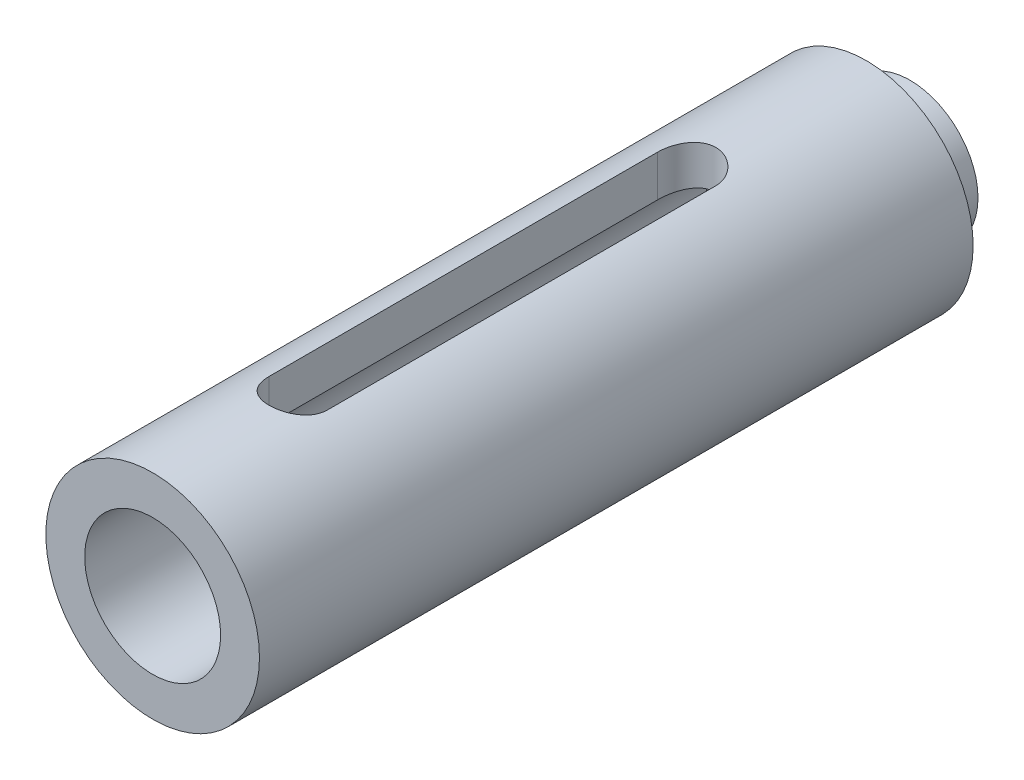
ISO-10303-21;
HEADER;
FILE_DESCRIPTION(('STEP AP214'),'2;1');
FILE_NAME('part.step','',(''),(''),'','','');
FILE_SCHEMA(('AUTOMOTIVE_DESIGN { 1 0 10303 214 1 1 1 1 }'));
ENDSEC;
DATA;
#1=APPLICATION_CONTEXT('core data for automotive mechanical design processes');
#2=APPLICATION_PROTOCOL_DEFINITION('international standard','automotive_design',2000,#1);
#3=PRODUCT_CONTEXT('',#1,'mechanical');
#4=PRODUCT('Part','Part','',(#3));
#5=PRODUCT_RELATED_PRODUCT_CATEGORY('part','',(#4));
#6=PRODUCT_DEFINITION_FORMATION('','',#4);
#7=PRODUCT_DEFINITION_CONTEXT('part definition',#1,'design');
#8=PRODUCT_DEFINITION('design','',#6,#7);
#9=PRODUCT_DEFINITION_SHAPE('','',#8);
#10=(LENGTH_UNIT() NAMED_UNIT(*) SI_UNIT(.MILLI.,.METRE.));
#11=(NAMED_UNIT(*) PLANE_ANGLE_UNIT() SI_UNIT($,.RADIAN.));
#12=(NAMED_UNIT(*) SI_UNIT($,.STERADIAN.) SOLID_ANGLE_UNIT());
#13=UNCERTAINTY_MEASURE_WITH_UNIT(LENGTH_MEASURE(1.E-05),#10,'distance_accuracy_value','');
#14=(GEOMETRIC_REPRESENTATION_CONTEXT(3) GLOBAL_UNCERTAINTY_ASSIGNED_CONTEXT((#13)) GLOBAL_UNIT_ASSIGNED_CONTEXT((#10,
#11,#12)) REPRESENTATION_CONTEXT('',''));
#15=CARTESIAN_POINT('',(0.,0.,0.));
#16=DIRECTION('',(0.,0.,1.));
#17=DIRECTION('',(1.,0.,0.));
#18=AXIS2_PLACEMENT_3D('',#15,#16,#17);
#19=CARTESIAN_POINT('',(0.,0.,39.));
#20=DIRECTION('',(0.,0.,-1.));
#21=DIRECTION('',(-1.,0.,0.));
#22=AXIS2_PLACEMENT_3D('',#19,#20,#21);
#23=CYLINDRICAL_SURFACE('',#22,5.5);
#24=CARTESIAN_POINT('',(0.,0.,39.));
#25=DIRECTION('',(0.,0.,1.));
#26=DIRECTION('',(1.,0.,0.));
#27=AXIS2_PLACEMENT_3D('',#24,#25,#26);
#28=CIRCLE('',#27,5.5);
#29=CARTESIAN_POINT('',(5.5,0.,39.));
#30=VERTEX_POINT('',#29);
#31=EDGE_CURVE('E190',#30,#30,#28,.T.);
#32=ORIENTED_EDGE('',*,*,#31,.F.);
#33=EDGE_LOOP('',(#32));
#34=FACE_BOUND('',#33,.T.);
#35=CARTESIAN_POINT('',(0.,0.,2.25));
#36=DIRECTION('',(0.,0.,1.));
#37=DIRECTION('',(1.,0.,0.));
#38=AXIS2_PLACEMENT_3D('',#35,#36,#37);
#39=CIRCLE('',#38,5.5);
#40=CARTESIAN_POINT('',(5.5,0.,2.25));
#41=VERTEX_POINT('',#40);
#42=EDGE_CURVE('E193',#41,#41,#39,.T.);
#43=ORIENTED_EDGE('',*,*,#42,.T.);
#44=EDGE_LOOP('',(#43));
#45=FACE_BOUND('',#44,.T.);
#46=CARTESIAN_POINT('',(-1.5,5.29150262212918,31.5));
#47=CARTESIAN_POINT('',(-1.50000065614258,5.29149951287645,31.5413586771312));
#48=CARTESIAN_POINT('',(-1.49828836695378,5.29198813067695,31.5826967174448));
#49=CARTESIAN_POINT('',(-1.4914634878254,5.29391683071276,31.665060919094));
#50=CARTESIAN_POINT('',(-1.48635155213404,5.29535672987746,31.7060871389019));
#51=CARTESIAN_POINT('',(-1.4659957743833,5.30104390546256,31.8280638279342));
#52=CARTESIAN_POINT('',(-1.44573158809946,5.3066590533821,31.9081717517128));
#53=CARTESIAN_POINT('',(-1.39248960546167,5.32087596000829,32.0636823792342));
#54=CARTESIAN_POINT('',(-1.35951439878664,5.32947711032649,32.1390860377668));
#55=CARTESIAN_POINT('',(-1.28183272379104,5.34869152359558,32.2833363247575));
#56=CARTESIAN_POINT('',(-1.23712210444531,5.35930549814899,32.3521806212842));
#57=CARTESIAN_POINT('',(-1.13600122474008,5.38165753008407,32.4831093842187));
#58=CARTESIAN_POINT('',(-1.07934088585637,5.39341613066433,32.5449971540217));
#59=CARTESIAN_POINT('',(-0.956461732608837,5.41655647328188,32.6585245043545));
#60=CARTESIAN_POINT('',(-0.890241359657288,5.42793815349654,32.710162410566));
#61=CARTESIAN_POINT('',(-0.74874592637817,5.44927296987059,32.8025497869689));
#62=CARTESIAN_POINT('',(-0.673337368132524,5.45919887577009,32.8431016292155));
#63=CARTESIAN_POINT('',(-0.516459920283584,5.47626555970112,32.9108741176048));
#64=CARTESIAN_POINT('',(-0.434992386948293,5.48340695880811,32.9380977369125));
#65=CARTESIAN_POINT('',(-0.270372333378635,5.4939545039919,32.9778008905397));
#66=CARTESIAN_POINT('',(-0.187306582582991,5.49744582097804,32.9906171693652));
#67=CARTESIAN_POINT('',(-0.0201336919041043,5.50059802936423,33.0022023262439));
#68=CARTESIAN_POINT('',(0.0639732864586811,5.5002595076115,33.0009733564539));
#69=CARTESIAN_POINT('',(0.228490462517258,5.49585205334204,32.9847375636845));
#70=CARTESIAN_POINT('',(0.308939654543513,5.49188174604376,32.9700949870401));
#71=CARTESIAN_POINT('',(0.466191763842098,5.48077387077341,32.9280373916438));
#72=CARTESIAN_POINT('',(0.542994504246747,5.4736361493423,32.9006217540427));
#73=CARTESIAN_POINT('',(0.691693940248361,5.45685080885045,32.8335225667126));
#74=CARTESIAN_POINT('',(0.763532127876887,5.4471781578563,32.7937158769118));
#75=CARTESIAN_POINT('',(0.899630490987049,5.42636266875342,32.7030600650156));
#76=CARTESIAN_POINT('',(0.963889270458089,5.41521956060735,32.6522089135854));
#77=CARTESIAN_POINT('',(1.08517422056187,5.39224743714906,32.5389883824669));
#78=CARTESIAN_POINT('',(1.14190346514491,5.38040788259406,32.4763027230678));
#79=CARTESIAN_POINT('',(1.24413117092707,5.35769431111201,32.3421688095626));
#80=CARTESIAN_POINT('',(1.28962650490379,5.34682056357816,32.2707181237724));
#81=CARTESIAN_POINT('',(1.36833955307723,5.32722349729034,32.1204025936236));
#82=CARTESIAN_POINT('',(1.40146611945396,5.3185162949769,32.0414878786216));
#83=CARTESIAN_POINT('',(1.45384162162887,5.3044408104789,31.8789564527364));
#84=CARTESIAN_POINT('',(1.47311145681179,5.29906750164299,31.7953470288624));
#85=CARTESIAN_POINT('',(1.49007935332103,5.29430661617749,31.6758227800667));
#86=CARTESIAN_POINT('',(1.49379981070631,5.29325702758222,31.6407417701382));
#87=CARTESIAN_POINT('',(1.49875756431611,5.29185517593002,31.5704462233799));
#88=CARTESIAN_POINT('',(1.49999874802878,5.29150182119389,31.5352319824707));
#89=CARTESIAN_POINT('',(1.5,5.29150262212918,31.5));
#90=B_SPLINE_CURVE_WITH_KNOTS('',3,(#46,#47,#48,#49,#50,#51,#52,#53,#54,#55,#56,#57,#58,#59,#60,
#61,#62,#63,#64,#65,#66,#67,#68,#69,#70,#71,#72,#73,#74,#75,#76,#77,#78,#79,#80,#81,#82,#83,#84,
#85,#86,#87,#88,#89),.UNSPECIFIED.,.F.,.F.,(4,2,2,2,2,2,2,2,2,2,2,2,2,2,2,2,2,2,2,2,2,4),(0.,
0.12399719781435,0.247970539772065,0.495149163222105,0.742277454344912,0.989493277237657,
1.24251425254214,1.49557652494464,1.75289280816834,2.01015166492879,2.26126373288136,
2.51233732338575,2.75678883822397,3.00125219786344,3.24822703625944,3.49524729282972,
3.75016526342509,4.00515411661573,4.26198658762753,4.51843087447629,4.62423405012692,
4.72987119631509),.UNSPECIFIED.);
#91=CARTESIAN_POINT('',(-1.5,5.29150262212918,31.5));
#92=VERTEX_POINT('',#91);
#93=CARTESIAN_POINT('',(1.5,5.29150262212918,31.5));
#94=VERTEX_POINT('',#93);
#95=EDGE_CURVE('E75',#92,#94,#90,.T.);
#96=ORIENTED_EDGE('',*,*,#95,.F.);
#97=DIRECTION('',(0.,0.,-1.));
#98=VECTOR('',#97,1.);
#99=CARTESIAN_POINT('',(-1.5,5.29150262212918,39.));
#100=LINE('',#99,#98);
#101=CARTESIAN_POINT('',(-1.5,5.29150262212918,11.5));
#102=VERTEX_POINT('',#101);
#103=EDGE_CURVE('E116',#102,#92,#100,.F.);
#104=ORIENTED_EDGE('',*,*,#103,.F.);
#105=CARTESIAN_POINT('',(1.5,5.29150262212918,11.5));
#106=CARTESIAN_POINT('',(1.50000065614258,5.29149951287646,11.4586413228689));
#107=CARTESIAN_POINT('',(1.49828836695378,5.29198813067696,11.4173032825552));
#108=CARTESIAN_POINT('',(1.4914634878254,5.29391683071276,11.334939080906));
#109=CARTESIAN_POINT('',(1.48635155213404,5.29535672987746,11.2939128610981));
#110=CARTESIAN_POINT('',(1.4659957743833,5.30104390546256,11.1719361720658));
#111=CARTESIAN_POINT('',(1.44573158809946,5.3066590533821,11.0918282482872));
#112=CARTESIAN_POINT('',(1.39248960546167,5.32087596000829,10.9363176207658));
#113=CARTESIAN_POINT('',(1.35951439878664,5.32947711032649,10.8609139622332));
#114=CARTESIAN_POINT('',(1.28183272379104,5.34869152359558,10.7166636752425));
#115=CARTESIAN_POINT('',(1.23712210444531,5.35930549814899,10.6478193787158));
#116=CARTESIAN_POINT('',(1.13600122474008,5.38165753008407,10.5168906157813));
#117=CARTESIAN_POINT('',(1.07934088585636,5.39341613066433,10.4550028459783));
#118=CARTESIAN_POINT('',(0.956461732608836,5.41655647328188,10.3414754956455));
#119=CARTESIAN_POINT('',(0.890241359657286,5.42793815349654,10.289837589434));
#120=CARTESIAN_POINT('',(0.748745926378168,5.44927296987059,10.1974502130311));
#121=CARTESIAN_POINT('',(0.673337368132523,5.45919887577009,10.1568983707845));
#122=CARTESIAN_POINT('',(0.516459920283583,5.47626555970112,10.0891258823952));
#123=CARTESIAN_POINT('',(0.434992386948292,5.48340695880811,10.0619022630875));
#124=CARTESIAN_POINT('',(0.270372333378634,5.4939545039919,10.0221991094603));
#125=CARTESIAN_POINT('',(0.187306582582992,5.49744582097804,10.0093828306348));
#126=CARTESIAN_POINT('',(0.0201336919041063,5.50059802936423,9.99779767375611));
#127=CARTESIAN_POINT('',(-0.0639732864586786,5.50025950761149,9.99902664354613));
#128=CARTESIAN_POINT('',(-0.228490462517255,5.49585205334204,10.0152624363155));
#129=CARTESIAN_POINT('',(-0.30893965454351,5.49188174604376,10.0299050129599));
#130=CARTESIAN_POINT('',(-0.466191763842096,5.48077387077341,10.0719626083562));
#131=CARTESIAN_POINT('',(-0.542994504246745,5.47363614934231,10.0993782459573));
#132=CARTESIAN_POINT('',(-0.691693940248361,5.45685080885045,10.1664774332874));
#133=CARTESIAN_POINT('',(-0.763532127876888,5.4471781578563,10.2062841230882));
#134=CARTESIAN_POINT('',(-0.899630490987049,5.42636266875342,10.2969399349844));
#135=CARTESIAN_POINT('',(-0.963889270458088,5.41521956060735,10.3477910864146));
#136=CARTESIAN_POINT('',(-1.08517422056187,5.39224743714906,10.4610116175331));
#137=CARTESIAN_POINT('',(-1.14190346514491,5.38040788259406,10.5236972769322));
#138=CARTESIAN_POINT('',(-1.24413117092707,5.35769431111201,10.6578311904374));
#139=CARTESIAN_POINT('',(-1.28962650490378,5.34682056357816,10.7292818762276));
#140=CARTESIAN_POINT('',(-1.36833955307723,5.32722349729034,10.8795974063764));
#141=CARTESIAN_POINT('',(-1.40146611945396,5.3185162949769,10.9585121213784));
#142=CARTESIAN_POINT('',(-1.45384162162886,5.3044408104789,11.1210435472636));
#143=CARTESIAN_POINT('',(-1.47311145681179,5.29906750164299,11.2046529711376));
#144=CARTESIAN_POINT('',(-1.49007935332103,5.29430661617749,11.3241772199333));
#145=CARTESIAN_POINT('',(-1.4937998107063,5.29325702758222,11.3592582298618));
#146=CARTESIAN_POINT('',(-1.49875756431611,5.29185517593002,11.4295537766201));
#147=CARTESIAN_POINT('',(-1.49999874802878,5.29150182119389,11.4647680175292));
#148=CARTESIAN_POINT('',(-1.5,5.29150262212918,11.5));
#149=B_SPLINE_CURVE_WITH_KNOTS('',3,(#105,#106,#107,#108,#109,#110,#111,#112,#113,#114,#115,
#116,#117,#118,#119,#120,#121,#122,#123,#124,#125,#126,#127,#128,#129,#130,#131,#132,#133,#134,
#135,#136,#137,#138,#139,#140,#141,#142,#143,#144,#145,#146,#147,#148),.UNSPECIFIED.,.F.,.F.,(4,
2,2,2,2,2,2,2,2,2,2,2,2,2,2,2,2,2,2,2,2,4),(0.,0.123997197814348,0.24797053977206,
0.495149163222103,0.742277454344915,0.989493277237657,1.24251425254214,1.49557652494464,
1.75289280816834,2.01015166492879,2.26126373288136,2.51233732338574,2.75678883822397,
3.00125219786344,3.24822703625944,3.49524729282972,3.75016526342509,4.00515411661572,
4.26198658762753,4.51843087447629,4.62423405012691,4.72987119631509),.UNSPECIFIED.);
#150=CARTESIAN_POINT('',(1.5,5.29150262212918,11.5));
#151=VERTEX_POINT('',#150);
#152=EDGE_CURVE('E110',#151,#102,#149,.T.);
#153=ORIENTED_EDGE('',*,*,#152,.F.);
#154=DIRECTION('',(0.,0.,-1.));
#155=VECTOR('',#154,1.);
#156=CARTESIAN_POINT('',(1.5,5.29150262212918,39.));
#157=LINE('',#156,#155);
#158=EDGE_CURVE('E100',#94,#151,#157,.T.);
#159=ORIENTED_EDGE('',*,*,#158,.F.);
#160=EDGE_LOOP('',(#96,#104,#153,#159));
#161=FACE_BOUND('',#160,.T.);
#162=ADVANCED_FACE('F53',(#34,#45,#161),#23,.T.);
#163=CARTESIAN_POINT('',(0.,0.,6.));
#164=DIRECTION('',(0.,0.,1.));
#165=DIRECTION('',(1.,0.,0.));
#166=AXIS2_PLACEMENT_3D('',#163,#164,#165);
#167=CYLINDRICAL_SURFACE('',#166,3.5);
#168=CARTESIAN_POINT('',(0.,0.,39.));
#169=DIRECTION('',(0.,0.,1.));
#170=DIRECTION('',(1.,0.,0.));
#171=AXIS2_PLACEMENT_3D('',#168,#169,#170);
#172=CIRCLE('',#171,3.5);
#173=CARTESIAN_POINT('',(3.5,0.,39.));
#174=VERTEX_POINT('',#173);
#175=EDGE_CURVE('E195',#174,#174,#172,.T.);
#176=ORIENTED_EDGE('',*,*,#175,.T.);
#177=EDGE_LOOP('',(#176));
#178=FACE_BOUND('',#177,.T.);
#179=CARTESIAN_POINT('',(0.,0.,7.));
#180=DIRECTION('',(0.,0.,1.));
#181=DIRECTION('',(1.,0.,0.));
#182=AXIS2_PLACEMENT_3D('',#179,#180,#181);
#183=CIRCLE('',#182,3.5);
#184=CARTESIAN_POINT('',(3.5,0.,7.));
#185=VERTEX_POINT('',#184);
#186=EDGE_CURVE('E205',#185,#185,#183,.F.);
#187=ORIENTED_EDGE('',*,*,#186,.T.);
#188=EDGE_LOOP('',(#187));
#189=FACE_BOUND('',#188,.T.);
#190=CARTESIAN_POINT('',(-1.5,3.16227766016838,11.5));
#191=CARTESIAN_POINT('',(-1.50000205158182,3.16227172915896,11.4599135146663));
#192=CARTESIAN_POINT('',(-1.49839203232259,3.1630408475052,11.4198485718744));
#193=CARTESIAN_POINT('',(-1.49198428946633,3.16607042202108,11.3400484203015));
#194=CARTESIAN_POINT('',(-1.48718796282877,3.16833022463316,11.3003130747429));
#195=CARTESIAN_POINT('',(-1.46813912125427,3.17722728946027,11.1823937689412));
#196=CARTESIAN_POINT('',(-1.44922583932205,3.18598345536625,11.1050687808182));
#197=CARTESIAN_POINT('',(-1.39976461136192,3.20801790875919,10.9551156075282));
#198=CARTESIAN_POINT('',(-1.36923164559686,3.22129037144911,10.8824815152318));
#199=CARTESIAN_POINT('',(-1.2974990785691,3.25084584760997,10.7432742371671));
#200=CARTESIAN_POINT('',(-1.25628763381382,3.26713219801237,10.6767078926545));
#201=CARTESIAN_POINT('',(-1.1615127619978,3.30205717606893,10.5472677131178));
#202=CARTESIAN_POINT('',(-1.10736251117419,3.32077798174483,10.4848457931263));
#203=CARTESIAN_POINT('',(-0.989484514819077,3.35778717574372,10.3696396879861));
#204=CARTESIAN_POINT('',(-0.925754657803534,3.37607546770334,10.316857633299));
#205=CARTESIAN_POINT('',(-0.786887325105809,3.41118224346912,10.220040304264));
#206=CARTESIAN_POINT('',(-0.711357460352783,3.42789299069227,10.1765252226538));
#207=CARTESIAN_POINT('',(-0.553203285157879,3.45693715519552,10.1030178065824));
#208=CARTESIAN_POINT('',(-0.470582344296452,3.46927263739378,10.0730190912237));
#209=CARTESIAN_POINT('',(-0.305382852613865,3.48758727558559,10.0290676740215));
#210=CARTESIAN_POINT('',(-0.223049040583706,3.49387712926986,10.0143272294632));
#211=CARTESIAN_POINT('',(-0.0568512092475041,3.50052462207484,9.99875866798853));
#212=CARTESIAN_POINT('',(0.0270121642089485,3.5008847094983,9.99792480927038));
#213=CARTESIAN_POINT('',(0.188134909775348,3.49581014412271,10.0097951744332));
#214=CARTESIAN_POINT('',(0.265472112983466,3.49074670592789,10.0216321098349));
#215=CARTESIAN_POINT('',(0.416937196296515,3.4759108524252,10.0570124624822));
#216=CARTESIAN_POINT('',(0.491064896646151,3.46613817373677,10.0805565344921));
#217=CARTESIAN_POINT('',(0.635378523321033,3.44263354171508,10.138953093173));
#218=CARTESIAN_POINT('',(0.705486754278657,3.42884327932154,10.173973144561));
#219=CARTESIAN_POINT('',(0.83901686910716,3.39863858179159,10.2541581649458));
#220=CARTESIAN_POINT('',(0.902436253822039,3.38222317154386,10.2993269062087));
#221=CARTESIAN_POINT('',(1.02577016313475,3.34697002113492,10.402401400172));
#222=CARTESIAN_POINT('',(1.08507946000173,3.32804291875889,10.4610016817817));
#223=CARTESIAN_POINT('',(1.19330742755405,3.29079030157284,10.5873443548011));
#224=CARTESIAN_POINT('',(1.24222039124859,3.27246512182606,10.6550917342493));
#225=CARTESIAN_POINT('',(1.32996504850602,3.23782407189493,10.8009291201985));
#226=CARTESIAN_POINT('',(1.36835678335718,3.22160763084711,10.8793090537974));
#227=CARTESIAN_POINT('',(1.43110327719245,3.19423395895919,11.0422552843354));
#228=CARTESIAN_POINT('',(1.45548472338104,3.18306711820121,11.1268094716141));
#229=CARTESIAN_POINT('',(1.4814873301113,3.17100823245485,11.2601895278314));
#230=CARTESIAN_POINT('',(1.48841599831505,3.16775315136151,11.3078246910931));
#231=CARTESIAN_POINT('',(1.49767523433545,3.16338096148832,11.4036286930541));
#232=CARTESIAN_POINT('',(1.50000646350526,3.1622635452007,11.4517974539914));
#233=CARTESIAN_POINT('',(1.5,3.16227766016838,11.5));
#234=B_SPLINE_CURVE_WITH_KNOTS('',3,(#190,#191,#192,#193,#194,#195,#196,#197,#198,#199,#200,
#201,#202,#203,#204,#205,#206,#207,#208,#209,#210,#211,#212,#213,#214,#215,#216,#217,#218,#219,
#220,#221,#222,#223,#224,#225,#226,#227,#228,#229,#230,#231,#232,#233),.UNSPECIFIED.,.F.,.F.,(4,
2,2,2,2,2,2,2,2,2,2,2,2,2,2,2,2,2,2,2,2,4),(0.,0.120178259529695,0.240303864547873,
0.479289547584349,0.717968164917669,0.956912642123788,1.21000319798865,1.46314962070247,
1.72805510455523,1.99283539866898,2.24313667812652,2.49333460971909,2.7274403928306,
2.96155927063751,3.19926143660833,3.43705210302752,3.69241313593937,3.94791398743396,
4.21286818151524,4.47731599572957,4.62181159425245,4.76628640520367),.UNSPECIFIED.);
#235=CARTESIAN_POINT('',(-1.5,3.16227766016838,11.5));
#236=VERTEX_POINT('',#235);
#237=CARTESIAN_POINT('',(1.5,3.16227766016838,11.5));
#238=VERTEX_POINT('',#237);
#239=EDGE_CURVE('E11',#236,#238,#234,.T.);
#240=ORIENTED_EDGE('',*,*,#239,.F.);
#241=DIRECTION('',(0.,0.,1.));
#242=VECTOR('',#241,1.);
#243=CARTESIAN_POINT('',(-1.5,3.16227766016838,6.));
#244=LINE('',#243,#242);
#245=CARTESIAN_POINT('',(-1.5,3.16227766016838,31.5));
#246=VERTEX_POINT('',#245);
#247=EDGE_CURVE('E68',#246,#236,#244,.F.);
#248=ORIENTED_EDGE('',*,*,#247,.F.);
#249=CARTESIAN_POINT('',(1.5,3.16227766016838,31.5));
#250=CARTESIAN_POINT('',(1.50000205158182,3.16227172915896,31.5400864853337));
#251=CARTESIAN_POINT('',(1.49839203232259,3.1630408475052,31.5801514281256));
#252=CARTESIAN_POINT('',(1.49198428946633,3.16607042202108,31.6599515796985));
#253=CARTESIAN_POINT('',(1.48718796282877,3.16833022463316,31.6996869252571));
#254=CARTESIAN_POINT('',(1.46813912125427,3.17722728946027,31.8176062310588));
#255=CARTESIAN_POINT('',(1.44922583932205,3.18598345536625,31.8949312191818));
#256=CARTESIAN_POINT('',(1.39976461136192,3.20801790875919,32.0448843924718));
#257=CARTESIAN_POINT('',(1.36923164559687,3.22129037144911,32.1175184847682));
#258=CARTESIAN_POINT('',(1.2974990785691,3.25084584760997,32.2567257628329));
#259=CARTESIAN_POINT('',(1.25628763381383,3.26713219801237,32.3232921073455));
#260=CARTESIAN_POINT('',(1.1615127619978,3.30205717606893,32.4527322868822));
#261=CARTESIAN_POINT('',(1.10736251117419,3.32077798174483,32.5151542068737));
#262=CARTESIAN_POINT('',(0.989484514819079,3.35778717574372,32.6303603120139));
#263=CARTESIAN_POINT('',(0.925754657803536,3.37607546770334,32.683142366701));
#264=CARTESIAN_POINT('',(0.786887325105812,3.41118224346912,32.779959695736));
#265=CARTESIAN_POINT('',(0.711357460352786,3.42789299069227,32.8234747773462));
#266=CARTESIAN_POINT('',(0.55320328515788,3.45693715519552,32.8969821934176));
#267=CARTESIAN_POINT('',(0.470582344296453,3.46927263739377,32.9269809087763));
#268=CARTESIAN_POINT('',(0.305382852613867,3.48758727558559,32.9709323259785));
#269=CARTESIAN_POINT('',(0.223049040583709,3.49387712926986,32.9856727705369));
#270=CARTESIAN_POINT('',(0.0568512092475087,3.50052462207484,33.0012413320115));
#271=CARTESIAN_POINT('',(-0.0270121642089433,3.5008847094983,33.0020751907296));
#272=CARTESIAN_POINT('',(-0.188134909775342,3.49581014412271,32.9902048255668));
#273=CARTESIAN_POINT('',(-0.265472112983461,3.49074670592789,32.9783678901651));
#274=CARTESIAN_POINT('',(-0.416937196296511,3.4759108524252,32.9429875375179));
#275=CARTESIAN_POINT('',(-0.491064896646147,3.46613817373677,32.9194434655079));
#276=CARTESIAN_POINT('',(-0.635378523321029,3.44263354171508,32.861046906827));
#277=CARTESIAN_POINT('',(-0.705486754278652,3.42884327932154,32.826026855439));
#278=CARTESIAN_POINT('',(-0.839016869107154,3.39863858179159,32.7458418350542));
#279=CARTESIAN_POINT('',(-0.902436253822034,3.38222317154386,32.7006730937913));
#280=CARTESIAN_POINT('',(-1.02577016313474,3.34697002113492,32.597598599828));
#281=CARTESIAN_POINT('',(-1.08507946000172,3.32804291875889,32.5389983182183));
#282=CARTESIAN_POINT('',(-1.19330742755404,3.29079030157285,32.4126556451989));
#283=CARTESIAN_POINT('',(-1.24222039124859,3.27246512182606,32.3449082657507));
#284=CARTESIAN_POINT('',(-1.32996504850602,3.23782407189493,32.1990708798015));
#285=CARTESIAN_POINT('',(-1.36835678335717,3.22160763084711,32.1206909462026));
#286=CARTESIAN_POINT('',(-1.43110327719244,3.19423395895919,31.9577447156646));
#287=CARTESIAN_POINT('',(-1.45548472338104,3.18306711820121,31.873190528386));
#288=CARTESIAN_POINT('',(-1.4814873301113,3.17100823245484,31.7398104721686));
#289=CARTESIAN_POINT('',(-1.48841599831505,3.16775315136151,31.6921753089069));
#290=CARTESIAN_POINT('',(-1.49767523433545,3.16338096148832,31.5963713069459));
#291=CARTESIAN_POINT('',(-1.50000646350526,3.1622635452007,31.5482025460086));
#292=CARTESIAN_POINT('',(-1.5,3.16227766016838,31.5));
#293=B_SPLINE_CURVE_WITH_KNOTS('',3,(#249,#250,#251,#252,#253,#254,#255,#256,#257,#258,#259,
#260,#261,#262,#263,#264,#265,#266,#267,#268,#269,#270,#271,#272,#273,#274,#275,#276,#277,#278,
#279,#280,#281,#282,#283,#284,#285,#286,#287,#288,#289,#290,#291,#292),.UNSPECIFIED.,.F.,.F.,(4,
2,2,2,2,2,2,2,2,2,2,2,2,2,2,2,2,2,2,2,2,4),(0.,0.120178259529692,0.240303864547869,
0.479289547584345,0.717968164917653,0.956912642123792,1.21000319798865,1.46314962070247,
1.72805510455524,1.99283539866898,2.24313667812652,2.49333460971908,2.7274403928306,
2.96155927063751,3.19926143660833,3.43705210302752,3.69241313593936,3.94791398743395,
4.21286818151524,4.47731599572956,4.62181159425245,4.76628640520368),.UNSPECIFIED.);
#294=CARTESIAN_POINT('',(1.5,3.16227766016838,31.5));
#295=VERTEX_POINT('',#294);
#296=EDGE_CURVE('E153',#295,#246,#293,.T.);
#297=ORIENTED_EDGE('',*,*,#296,.F.);
#298=DIRECTION('',(0.,0.,1.));
#299=VECTOR('',#298,1.);
#300=CARTESIAN_POINT('',(1.5,3.16227766016838,6.));
#301=LINE('',#300,#299);
#302=EDGE_CURVE('E159',#238,#295,#301,.T.);
#303=ORIENTED_EDGE('',*,*,#302,.F.);
#304=EDGE_LOOP('',(#240,#248,#297,#303));
#305=FACE_BOUND('',#304,.T.);
#306=ADVANCED_FACE('F144',(#178,#189,#305),#167,.F.);
#307=CARTESIAN_POINT('',(0.,0.,2.25));
#308=DIRECTION('',(0.,0.,-1.));
#309=DIRECTION('',(-1.,0.,0.));
#310=AXIS2_PLACEMENT_3D('',#307,#308,#309);
#311=CYLINDRICAL_SURFACE('',#310,3.5);
#312=CARTESIAN_POINT('',(0.,0.,2.25));
#313=DIRECTION('',(0.,0.,1.));
#314=DIRECTION('',(1.,0.,0.));
#315=AXIS2_PLACEMENT_3D('',#312,#313,#314);
#316=CIRCLE('',#315,3.5);
#317=CARTESIAN_POINT('',(3.5,0.,2.25));
#318=VERTEX_POINT('',#317);
#319=EDGE_CURVE('E202',#318,#318,#316,.T.);
#320=ORIENTED_EDGE('',*,*,#319,.F.);
#321=EDGE_LOOP('',(#320));
#322=FACE_BOUND('',#321,.T.);
#323=CARTESIAN_POINT('',(0.,0.,0.));
#324=DIRECTION('',(0.,0.,1.));
#325=DIRECTION('',(1.,0.,0.));
#326=AXIS2_PLACEMENT_3D('',#323,#324,#325);
#327=CIRCLE('',#326,3.5);
#328=CARTESIAN_POINT('',(3.5,0.,0.));
#329=VERTEX_POINT('',#328);
#330=EDGE_CURVE('E197',#329,#329,#327,.T.);
#331=ORIENTED_EDGE('',*,*,#330,.T.);
#332=EDGE_LOOP('',(#331));
#333=FACE_BOUND('',#332,.T.);
#334=ADVANCED_FACE('F148',(#322,#333),#311,.T.);
#335=CARTESIAN_POINT('',(0.,0.,0.));
#336=DIRECTION('',(0.,0.,1.));
#337=DIRECTION('',(1.,0.,0.));
#338=AXIS2_PLACEMENT_3D('',#335,#336,#337);
#339=PLANE('',#338);
#340=CARTESIAN_POINT('',(0.,0.,0.));
#341=DIRECTION('',(0.,0.,-1.));
#342=DIRECTION('',(-1.,0.,0.));
#343=AXIS2_PLACEMENT_3D('',#340,#341,#342);
#344=CIRCLE('',#343,2.);
#345=CARTESIAN_POINT('',(-2.,0.,0.));
#346=VERTEX_POINT('',#345);
#347=EDGE_CURVE('E120',#346,#346,#344,.T.);
#348=ORIENTED_EDGE('',*,*,#347,.F.);
#349=EDGE_LOOP('',(#348));
#350=FACE_BOUND('',#349,.T.);
#351=ORIENTED_EDGE('',*,*,#330,.F.);
#352=EDGE_LOOP('',(#351));
#353=FACE_BOUND('',#352,.T.);
#354=ADVANCED_FACE('F217',(#350,#353),#339,.F.);
#355=CARTESIAN_POINT('',(0.,0.,39.));
#356=DIRECTION('',(0.,0.,1.));
#357=DIRECTION('',(1.,0.,0.));
#358=AXIS2_PLACEMENT_3D('',#355,#356,#357);
#359=PLANE('',#358);
#360=ORIENTED_EDGE('',*,*,#175,.F.);
#361=EDGE_LOOP('',(#360));
#362=FACE_BOUND('',#361,.T.);
#363=ORIENTED_EDGE('',*,*,#31,.T.);
#364=EDGE_LOOP('',(#363));
#365=FACE_BOUND('',#364,.T.);
#366=ADVANCED_FACE('F150',(#362,#365),#359,.T.);
#367=CARTESIAN_POINT('',(0.,0.,2.25));
#368=DIRECTION('',(0.,0.,1.));
#369=DIRECTION('',(1.,0.,0.));
#370=AXIS2_PLACEMENT_3D('',#367,#368,#369);
#371=PLANE('',#370);
#372=ORIENTED_EDGE('',*,*,#319,.T.);
#373=EDGE_LOOP('',(#372));
#374=FACE_BOUND('',#373,.T.);
#375=ORIENTED_EDGE('',*,*,#42,.F.);
#376=EDGE_LOOP('',(#375));
#377=FACE_BOUND('',#376,.T.);
#378=ADVANCED_FACE('F142',(#374,#377),#371,.F.);
#379=CARTESIAN_POINT('',(0.,0.,39.001));
#380=DIRECTION('',(0.,0.,-1.));
#381=DIRECTION('',(-1.,0.,0.));
#382=AXIS2_PLACEMENT_3D('',#379,#380,#381);
#383=CYLINDRICAL_SURFACE('',#382,2.);
#384=CARTESIAN_POINT('',(0.,0.,6.));
#385=DIRECTION('',(0.,0.,1.));
#386=DIRECTION('',(1.,0.,0.));
#387=AXIS2_PLACEMENT_3D('',#384,#385,#386);
#388=CIRCLE('',#387,2.);
#389=CARTESIAN_POINT('',(2.,0.,6.));
#390=VERTEX_POINT('',#389);
#391=EDGE_CURVE('E117',#390,#390,#388,.F.);
#392=ORIENTED_EDGE('',*,*,#391,.F.);
#393=EDGE_LOOP('',(#392));
#394=FACE_BOUND('',#393,.T.);
#395=ORIENTED_EDGE('',*,*,#347,.T.);
#396=EDGE_LOOP('',(#395));
#397=FACE_BOUND('',#396,.T.);
#398=ADVANCED_FACE('F139',(#394,#397),#383,.F.);
#399=CARTESIAN_POINT('',(0.,0.,6.));
#400=DIRECTION('',(0.,0.,1.));
#401=DIRECTION('',(1.,0.,0.));
#402=AXIS2_PLACEMENT_3D('',#399,#400,#401);
#403=CONICAL_SURFACE('',#402,2.00000000000001,0.982793723247328);
#404=ORIENTED_EDGE('',*,*,#186,.F.);
#405=EDGE_LOOP('',(#404));
#406=FACE_BOUND('',#405,.T.);
#407=ORIENTED_EDGE('',*,*,#391,.T.);
#408=EDGE_LOOP('',(#407));
#409=FACE_BOUND('',#408,.T.);
#410=ADVANCED_FACE('F56',(#406,#409),#403,.F.);
#411=CARTESIAN_POINT('',(0.,5.5,11.5));
#412=DIRECTION('',(0.,-1.,0.));
#413=DIRECTION('',(0.,0.,-1.));
#414=AXIS2_PLACEMENT_3D('',#411,#412,#413);
#415=CYLINDRICAL_SURFACE('',#414,1.5);
#416=ORIENTED_EDGE('',*,*,#152,.T.);
#417=DIRECTION('',(0.,-1.,0.));
#418=VECTOR('',#417,1.);
#419=CARTESIAN_POINT('',(-1.5,5.5,11.5));
#420=LINE('',#419,#418);
#421=EDGE_CURVE('E105',#102,#236,#420,.T.);
#422=ORIENTED_EDGE('',*,*,#421,.T.);
#423=ORIENTED_EDGE('',*,*,#239,.T.);
#424=DIRECTION('',(0.,-1.,0.));
#425=VECTOR('',#424,1.);
#426=CARTESIAN_POINT('',(1.5,5.5,11.5));
#427=LINE('',#426,#425);
#428=EDGE_CURVE('E83',#151,#238,#427,.T.);
#429=ORIENTED_EDGE('',*,*,#428,.F.);
#430=EDGE_LOOP('',(#416,#422,#423,#429));
#431=FACE_BOUND('',#430,.T.);
#432=ADVANCED_FACE('F108',(#431),#415,.F.);
#433=CARTESIAN_POINT('',(-1.5,5.5,11.5));
#434=DIRECTION('',(1.,0.,0.));
#435=DIRECTION('',(0.,0.,-1.));
#436=AXIS2_PLACEMENT_3D('',#433,#434,#435);
#437=PLANE('',#436);
#438=ORIENTED_EDGE('',*,*,#103,.T.);
#439=DIRECTION('',(0.,-1.,0.));
#440=VECTOR('',#439,1.);
#441=CARTESIAN_POINT('',(-1.5,5.5,31.5));
#442=LINE('',#441,#440);
#443=EDGE_CURVE('E172',#92,#246,#442,.T.);
#444=ORIENTED_EDGE('',*,*,#443,.T.);
#445=ORIENTED_EDGE('',*,*,#247,.T.);
#446=ORIENTED_EDGE('',*,*,#421,.F.);
#447=EDGE_LOOP('',(#438,#444,#445,#446));
#448=FACE_BOUND('',#447,.T.);
#449=ADVANCED_FACE('F137',(#448),#437,.T.);
#450=CARTESIAN_POINT('',(0.,5.5,31.5));
#451=DIRECTION('',(0.,-1.,0.));
#452=DIRECTION('',(0.,0.,-1.));
#453=AXIS2_PLACEMENT_3D('',#450,#451,#452);
#454=CYLINDRICAL_SURFACE('',#453,1.5);
#455=ORIENTED_EDGE('',*,*,#95,.T.);
#456=DIRECTION('',(0.,-1.,0.));
#457=VECTOR('',#456,1.);
#458=CARTESIAN_POINT('',(1.5,5.5,31.5));
#459=LINE('',#458,#457);
#460=EDGE_CURVE('E102',#94,#295,#459,.T.);
#461=ORIENTED_EDGE('',*,*,#460,.T.);
#462=ORIENTED_EDGE('',*,*,#296,.T.);
#463=ORIENTED_EDGE('',*,*,#443,.F.);
#464=EDGE_LOOP('',(#455,#461,#462,#463));
#465=FACE_BOUND('',#464,.T.);
#466=ADVANCED_FACE('F161',(#465),#454,.F.);
#467=CARTESIAN_POINT('',(1.5,5.5,11.5));
#468=DIRECTION('',(-1.,0.,0.));
#469=DIRECTION('',(0.,0.,1.));
#470=AXIS2_PLACEMENT_3D('',#467,#468,#469);
#471=PLANE('',#470);
#472=ORIENTED_EDGE('',*,*,#158,.T.);
#473=ORIENTED_EDGE('',*,*,#428,.T.);
#474=ORIENTED_EDGE('',*,*,#302,.T.);
#475=ORIENTED_EDGE('',*,*,#460,.F.);
#476=EDGE_LOOP('',(#472,#473,#474,#475));
#477=FACE_BOUND('',#476,.T.);
#478=ADVANCED_FACE('F101',(#477),#471,.T.);
#479=CLOSED_SHELL('',(#162,#306,#334,#354,#366,#378,#398,#410,#432,#449,#466,#478));
#480=MANIFOLD_SOLID_BREP('B2',#479);
#481=ADVANCED_BREP_SHAPE_REPRESENTATION('',(#18,#480),#14);
#482=SHAPE_DEFINITION_REPRESENTATION(#9,#481);
ENDSEC;
END-ISO-10303-21;
